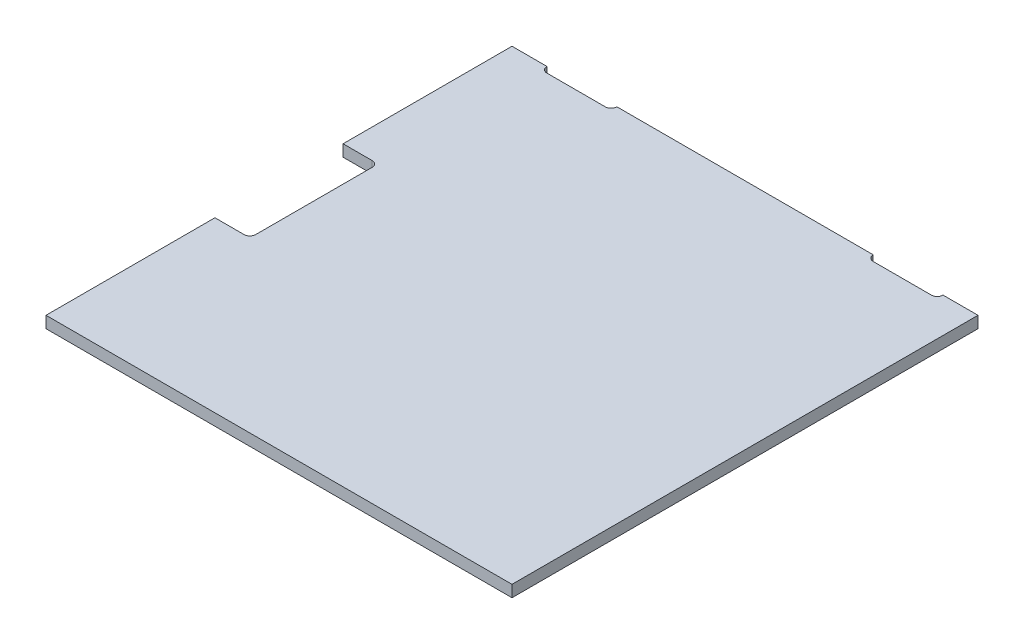
ISO-10303-21;
HEADER;
FILE_DESCRIPTION(('STEP AP214'),'2;1');
FILE_NAME('part.step','',(''),(''),'','','');
FILE_SCHEMA(('AUTOMOTIVE_DESIGN { 1 0 10303 214 1 1 1 1 }'));
ENDSEC;
DATA;
#1=APPLICATION_CONTEXT('core data for automotive mechanical design processes');
#2=APPLICATION_PROTOCOL_DEFINITION('international standard','automotive_design',2000,#1);
#3=PRODUCT_CONTEXT('',#1,'mechanical');
#4=PRODUCT('Part','Part','',(#3));
#5=PRODUCT_RELATED_PRODUCT_CATEGORY('part','',(#4));
#6=PRODUCT_DEFINITION_FORMATION('','',#4);
#7=PRODUCT_DEFINITION_CONTEXT('part definition',#1,'design');
#8=PRODUCT_DEFINITION('design','',#6,#7);
#9=PRODUCT_DEFINITION_SHAPE('','',#8);
#10=(LENGTH_UNIT() NAMED_UNIT(*) SI_UNIT(.MILLI.,.METRE.));
#11=(NAMED_UNIT(*) PLANE_ANGLE_UNIT() SI_UNIT($,.RADIAN.));
#12=(NAMED_UNIT(*) SI_UNIT($,.STERADIAN.) SOLID_ANGLE_UNIT());
#13=UNCERTAINTY_MEASURE_WITH_UNIT(LENGTH_MEASURE(1.E-05),#10,'distance_accuracy_value','');
#14=(GEOMETRIC_REPRESENTATION_CONTEXT(3) GLOBAL_UNCERTAINTY_ASSIGNED_CONTEXT((#13)) GLOBAL_UNIT_ASSIGNED_CONTEXT((#10,
#11,#12)) REPRESENTATION_CONTEXT('',''));
#15=CARTESIAN_POINT('',(0.,0.,0.));
#16=DIRECTION('',(0.,0.,1.));
#17=DIRECTION('',(1.,0.,0.));
#18=AXIS2_PLACEMENT_3D('',#15,#16,#17);
#19=CARTESIAN_POINT('',(-40.,2.,-40.));
#20=DIRECTION('',(0.,0.,1.));
#21=DIRECTION('',(1.,0.,0.));
#22=AXIS2_PLACEMENT_3D('',#19,#20,#21);
#23=PLANE('',#22);
#24=DIRECTION('',(-1.,0.,0.));
#25=VECTOR('',#24,1.);
#26=CARTESIAN_POINT('',(-40.,0.,-40.));
#27=LINE('',#26,#25);
#28=CARTESIAN_POINT('',(22.,0.,-40.));
#29=VERTEX_POINT('',#28);
#30=CARTESIAN_POINT('',(-22.,0.,-40.));
#31=VERTEX_POINT('',#30);
#32=EDGE_CURVE('E184',#29,#31,#27,.T.);
#33=ORIENTED_EDGE('',*,*,#32,.T.);
#34=DIRECTION('',(0.,1.,0.));
#35=VECTOR('',#34,1.);
#36=CARTESIAN_POINT('',(-22.,0.,-40.));
#37=LINE('',#36,#35);
#38=CARTESIAN_POINT('',(-22.,2.,-40.));
#39=VERTEX_POINT('',#38);
#40=EDGE_CURVE('E174',#31,#39,#37,.T.);
#41=ORIENTED_EDGE('',*,*,#40,.T.);
#42=DIRECTION('',(-1.,0.,0.));
#43=VECTOR('',#42,1.);
#44=CARTESIAN_POINT('',(-40.,2.,-40.));
#45=LINE('',#44,#43);
#46=CARTESIAN_POINT('',(22.,2.,-40.));
#47=VERTEX_POINT('',#46);
#48=EDGE_CURVE('E351',#47,#39,#45,.T.);
#49=ORIENTED_EDGE('',*,*,#48,.F.);
#50=DIRECTION('',(0.,1.,0.));
#51=VECTOR('',#50,1.);
#52=CARTESIAN_POINT('',(22.,0.,-40.));
#53=LINE('',#52,#51);
#54=EDGE_CURVE('E333',#29,#47,#53,.T.);
#55=ORIENTED_EDGE('',*,*,#54,.F.);
#56=EDGE_LOOP('',(#33,#41,#49,#55));
#57=FACE_BOUND('',#56,.T.);
#58=ADVANCED_FACE('F38',(#57),#23,.F.);
#59=CARTESIAN_POINT('',(-34.,2.,-40.));
#60=VERTEX_POINT('',#59);
#61=CARTESIAN_POINT('',(-40.,2.,-40.));
#62=VERTEX_POINT('',#61);
#63=EDGE_CURVE('E170',#60,#62,#45,.T.);
#64=ORIENTED_EDGE('',*,*,#63,.F.);
#65=DIRECTION('',(0.,1.,0.));
#66=VECTOR('',#65,1.);
#67=CARTESIAN_POINT('',(-34.,0.,-40.));
#68=LINE('',#67,#66);
#69=CARTESIAN_POINT('',(-34.,0.,-40.));
#70=VERTEX_POINT('',#69);
#71=EDGE_CURVE('E164',#70,#60,#68,.T.);
#72=ORIENTED_EDGE('',*,*,#71,.F.);
#73=CARTESIAN_POINT('',(-40.,0.,-40.));
#74=VERTEX_POINT('',#73);
#75=EDGE_CURVE('E168',#70,#74,#27,.T.);
#76=ORIENTED_EDGE('',*,*,#75,.T.);
#77=DIRECTION('',(0.,-1.,0.));
#78=VECTOR('',#77,1.);
#79=CARTESIAN_POINT('',(-40.,2.,-40.));
#80=LINE('',#79,#78);
#81=EDGE_CURVE('E286',#62,#74,#80,.T.);
#82=ORIENTED_EDGE('',*,*,#81,.F.);
#83=EDGE_LOOP('',(#64,#72,#76,#82));
#84=FACE_BOUND('',#83,.T.);
#85=ADVANCED_FACE('F166',(#84),#23,.F.);
#86=CARTESIAN_POINT('',(40.,2.,40.));
#87=DIRECTION('',(-1.,0.,0.));
#88=DIRECTION('',(0.,0.,1.));
#89=AXIS2_PLACEMENT_3D('',#86,#87,#88);
#90=PLANE('',#89);
#91=DIRECTION('',(0.,0.,-1.));
#92=VECTOR('',#91,1.);
#93=CARTESIAN_POINT('',(40.,0.,40.));
#94=LINE('',#93,#92);
#95=CARTESIAN_POINT('',(40.,0.,40.));
#96=VERTEX_POINT('',#95);
#97=CARTESIAN_POINT('',(40.,0.,-40.));
#98=VERTEX_POINT('',#97);
#99=EDGE_CURVE('E185',#96,#98,#94,.T.);
#100=ORIENTED_EDGE('',*,*,#99,.T.);
#101=DIRECTION('',(0.,-1.,0.));
#102=VECTOR('',#101,1.);
#103=CARTESIAN_POINT('',(40.,2.,-40.));
#104=LINE('',#103,#102);
#105=CARTESIAN_POINT('',(40.,2.,-40.));
#106=VERTEX_POINT('',#105);
#107=EDGE_CURVE('E289',#106,#98,#104,.T.);
#108=ORIENTED_EDGE('',*,*,#107,.F.);
#109=DIRECTION('',(0.,0.,-1.));
#110=VECTOR('',#109,1.);
#111=CARTESIAN_POINT('',(40.,2.,40.));
#112=LINE('',#111,#110);
#113=CARTESIAN_POINT('',(40.,2.,40.));
#114=VERTEX_POINT('',#113);
#115=EDGE_CURVE('E270',#114,#106,#112,.T.);
#116=ORIENTED_EDGE('',*,*,#115,.F.);
#117=DIRECTION('',(0.,-1.,0.));
#118=VECTOR('',#117,1.);
#119=CARTESIAN_POINT('',(40.,2.,40.));
#120=LINE('',#119,#118);
#121=EDGE_CURVE('E271',#114,#96,#120,.T.);
#122=ORIENTED_EDGE('',*,*,#121,.T.);
#123=EDGE_LOOP('',(#100,#108,#116,#122));
#124=FACE_BOUND('',#123,.T.);
#125=ADVANCED_FACE('F383',(#124),#90,.F.);
#126=CARTESIAN_POINT('',(34.,0.,-40.));
#127=VERTEX_POINT('',#126);
#128=EDGE_CURVE('E187',#98,#127,#27,.T.);
#129=ORIENTED_EDGE('',*,*,#128,.T.);
#130=DIRECTION('',(0.,1.,0.));
#131=VECTOR('',#130,1.);
#132=CARTESIAN_POINT('',(34.,0.,-40.));
#133=LINE('',#132,#131);
#134=CARTESIAN_POINT('',(34.,2.,-40.));
#135=VERTEX_POINT('',#134);
#136=EDGE_CURVE('E326',#127,#135,#133,.T.);
#137=ORIENTED_EDGE('',*,*,#136,.T.);
#138=EDGE_CURVE('E347',#106,#135,#45,.T.);
#139=ORIENTED_EDGE('',*,*,#138,.F.);
#140=ORIENTED_EDGE('',*,*,#107,.T.);
#141=EDGE_LOOP('',(#129,#137,#139,#140));
#142=FACE_BOUND('',#141,.T.);
#143=ADVANCED_FACE('F325',(#142),#23,.F.);
#144=CARTESIAN_POINT('',(-40.,2.,-11.));
#145=DIRECTION('',(1.,0.,0.));
#146=DIRECTION('',(0.,0.,-1.));
#147=AXIS2_PLACEMENT_3D('',#144,#145,#146);
#148=PLANE('',#147);
#149=DIRECTION('',(0.,0.,1.));
#150=VECTOR('',#149,1.);
#151=CARTESIAN_POINT('',(-40.,0.,-11.));
#152=LINE('',#151,#150);
#153=CARTESIAN_POINT('',(-40.,0.,-11.));
#154=VERTEX_POINT('',#153);
#155=EDGE_CURVE('E182',#74,#154,#152,.T.);
#156=ORIENTED_EDGE('',*,*,#155,.T.);
#157=DIRECTION('',(0.,-1.,0.));
#158=VECTOR('',#157,1.);
#159=CARTESIAN_POINT('',(-40.,2.,-11.));
#160=LINE('',#159,#158);
#161=CARTESIAN_POINT('',(-40.,2.,-11.));
#162=VERTEX_POINT('',#161);
#163=EDGE_CURVE('E282',#162,#154,#160,.T.);
#164=ORIENTED_EDGE('',*,*,#163,.F.);
#165=DIRECTION('',(0.,0.,1.));
#166=VECTOR('',#165,1.);
#167=CARTESIAN_POINT('',(-40.,2.,-11.));
#168=LINE('',#167,#166);
#169=EDGE_CURVE('E350',#62,#162,#168,.T.);
#170=ORIENTED_EDGE('',*,*,#169,.F.);
#171=ORIENTED_EDGE('',*,*,#81,.T.);
#172=EDGE_LOOP('',(#156,#164,#170,#171));
#173=FACE_BOUND('',#172,.T.);
#174=ADVANCED_FACE('F367',(#173),#148,.F.);
#175=CARTESIAN_POINT('',(-34.,2.,-11.));
#176=DIRECTION('',(0.,0.,-1.));
#177=DIRECTION('',(-1.,0.,0.));
#178=AXIS2_PLACEMENT_3D('',#175,#176,#177);
#179=PLANE('',#178);
#180=DIRECTION('',(1.,0.,0.));
#181=VECTOR('',#180,1.);
#182=CARTESIAN_POINT('',(-34.,0.,-11.));
#183=LINE('',#182,#181);
#184=CARTESIAN_POINT('',(-35.,0.,-11.));
#185=VERTEX_POINT('',#184);
#186=EDGE_CURVE('E256',#154,#185,#183,.T.);
#187=ORIENTED_EDGE('',*,*,#186,.T.);
#188=DIRECTION('',(0.,-1.,0.));
#189=VECTOR('',#188,1.);
#190=CARTESIAN_POINT('',(-35.,2.,-11.));
#191=LINE('',#190,#189);
#192=CARTESIAN_POINT('',(-35.,2.,-11.));
#193=VERTEX_POINT('',#192);
#194=EDGE_CURVE('E54',#185,#193,#191,.F.);
#195=ORIENTED_EDGE('',*,*,#194,.T.);
#196=DIRECTION('',(1.,0.,0.));
#197=VECTOR('',#196,1.);
#198=CARTESIAN_POINT('',(-34.,2.,-11.));
#199=LINE('',#198,#197);
#200=EDGE_CURVE('E354',#162,#193,#199,.T.);
#201=ORIENTED_EDGE('',*,*,#200,.F.);
#202=ORIENTED_EDGE('',*,*,#163,.T.);
#203=EDGE_LOOP('',(#187,#195,#201,#202));
#204=FACE_BOUND('',#203,.T.);
#205=ADVANCED_FACE('F369',(#204),#179,.F.);
#206=CARTESIAN_POINT('',(-34.,2.,-11.));
#207=DIRECTION('',(1.,0.,0.));
#208=DIRECTION('',(0.,0.,-1.));
#209=AXIS2_PLACEMENT_3D('',#206,#207,#208);
#210=PLANE('',#209);
#211=DIRECTION('',(0.,0.,1.));
#212=VECTOR('',#211,1.);
#213=CARTESIAN_POINT('',(-34.,0.,-11.));
#214=LINE('',#213,#212);
#215=CARTESIAN_POINT('',(-34.,0.,-10.));
#216=VERTEX_POINT('',#215);
#217=CARTESIAN_POINT('',(-34.,0.,10.));
#218=VERTEX_POINT('',#217);
#219=EDGE_CURVE('E249',#216,#218,#214,.T.);
#220=ORIENTED_EDGE('',*,*,#219,.T.);
#221=DIRECTION('',(0.,-1.,0.));
#222=VECTOR('',#221,1.);
#223=CARTESIAN_POINT('',(-34.,2.,10.));
#224=LINE('',#223,#222);
#225=CARTESIAN_POINT('',(-34.,2.,10.));
#226=VERTEX_POINT('',#225);
#227=EDGE_CURVE('E214',#218,#226,#224,.F.);
#228=ORIENTED_EDGE('',*,*,#227,.T.);
#229=DIRECTION('',(0.,0.,1.));
#230=VECTOR('',#229,1.);
#231=CARTESIAN_POINT('',(-34.,2.,-11.));
#232=LINE('',#231,#230);
#233=CARTESIAN_POINT('',(-34.,2.,-10.));
#234=VERTEX_POINT('',#233);
#235=EDGE_CURVE('E234',#234,#226,#232,.T.);
#236=ORIENTED_EDGE('',*,*,#235,.F.);
#237=DIRECTION('',(0.,-1.,0.));
#238=VECTOR('',#237,1.);
#239=CARTESIAN_POINT('',(-34.,0.,-10.));
#240=LINE('',#239,#238);
#241=EDGE_CURVE('E210',#234,#216,#240,.T.);
#242=ORIENTED_EDGE('',*,*,#241,.T.);
#243=EDGE_LOOP('',(#220,#228,#236,#242));
#244=FACE_BOUND('',#243,.T.);
#245=ADVANCED_FACE('F253',(#244),#210,.F.);
#246=CARTESIAN_POINT('',(-34.,2.,11.));
#247=DIRECTION('',(0.,0.,1.));
#248=DIRECTION('',(1.,0.,0.));
#249=AXIS2_PLACEMENT_3D('',#246,#247,#248);
#250=PLANE('',#249);
#251=DIRECTION('',(-1.,0.,0.));
#252=VECTOR('',#251,1.);
#253=CARTESIAN_POINT('',(-34.,2.,11.));
#254=LINE('',#253,#252);
#255=CARTESIAN_POINT('',(-35.,2.,11.));
#256=VERTEX_POINT('',#255);
#257=CARTESIAN_POINT('',(-40.,2.,11.));
#258=VERTEX_POINT('',#257);
#259=EDGE_CURVE('E231',#256,#258,#254,.T.);
#260=ORIENTED_EDGE('',*,*,#259,.F.);
#261=DIRECTION('',(0.,-1.,0.));
#262=VECTOR('',#261,1.);
#263=CARTESIAN_POINT('',(-35.,0.,11.));
#264=LINE('',#263,#262);
#265=CARTESIAN_POINT('',(-35.,0.,11.));
#266=VERTEX_POINT('',#265);
#267=EDGE_CURVE('E206',#256,#266,#264,.T.);
#268=ORIENTED_EDGE('',*,*,#267,.T.);
#269=DIRECTION('',(-1.,0.,0.));
#270=VECTOR('',#269,1.);
#271=CARTESIAN_POINT('',(-34.,0.,11.));
#272=LINE('',#271,#270);
#273=CARTESIAN_POINT('',(-40.,0.,11.));
#274=VERTEX_POINT('',#273);
#275=EDGE_CURVE('E251',#266,#274,#272,.T.);
#276=ORIENTED_EDGE('',*,*,#275,.T.);
#277=DIRECTION('',(0.,-1.,0.));
#278=VECTOR('',#277,1.);
#279=CARTESIAN_POINT('',(-40.,2.,11.));
#280=LINE('',#279,#278);
#281=EDGE_CURVE('E242',#258,#274,#280,.T.);
#282=ORIENTED_EDGE('',*,*,#281,.F.);
#283=EDGE_LOOP('',(#260,#268,#276,#282));
#284=FACE_BOUND('',#283,.T.);
#285=ADVANCED_FACE('F239',(#284),#250,.F.);
#286=CARTESIAN_POINT('',(-40.,2.,40.));
#287=DIRECTION('',(1.,0.,0.));
#288=DIRECTION('',(0.,0.,-1.));
#289=AXIS2_PLACEMENT_3D('',#286,#287,#288);
#290=PLANE('',#289);
#291=DIRECTION('',(0.,0.,1.));
#292=VECTOR('',#291,1.);
#293=CARTESIAN_POINT('',(-40.,0.,40.));
#294=LINE('',#293,#292);
#295=CARTESIAN_POINT('',(-40.,0.,40.));
#296=VERTEX_POINT('',#295);
#297=EDGE_CURVE('E260',#274,#296,#294,.T.);
#298=ORIENTED_EDGE('',*,*,#297,.T.);
#299=DIRECTION('',(0.,-1.,0.));
#300=VECTOR('',#299,1.);
#301=CARTESIAN_POINT('',(-40.,2.,40.));
#302=LINE('',#301,#300);
#303=CARTESIAN_POINT('',(-40.,2.,40.));
#304=VERTEX_POINT('',#303);
#305=EDGE_CURVE('E275',#304,#296,#302,.T.);
#306=ORIENTED_EDGE('',*,*,#305,.F.);
#307=DIRECTION('',(0.,0.,1.));
#308=VECTOR('',#307,1.);
#309=CARTESIAN_POINT('',(-40.,2.,40.));
#310=LINE('',#309,#308);
#311=EDGE_CURVE('E245',#258,#304,#310,.T.);
#312=ORIENTED_EDGE('',*,*,#311,.F.);
#313=ORIENTED_EDGE('',*,*,#281,.T.);
#314=EDGE_LOOP('',(#298,#306,#312,#313));
#315=FACE_BOUND('',#314,.T.);
#316=ADVANCED_FACE('F440',(#315),#290,.F.);
#317=CARTESIAN_POINT('',(-40.,2.,40.));
#318=DIRECTION('',(0.,0.,-1.));
#319=DIRECTION('',(-1.,0.,0.));
#320=AXIS2_PLACEMENT_3D('',#317,#318,#319);
#321=PLANE('',#320);
#322=DIRECTION('',(1.,0.,0.));
#323=VECTOR('',#322,1.);
#324=CARTESIAN_POINT('',(-40.,0.,40.));
#325=LINE('',#324,#323);
#326=EDGE_CURVE('E267',#296,#96,#325,.T.);
#327=ORIENTED_EDGE('',*,*,#326,.T.);
#328=ORIENTED_EDGE('',*,*,#121,.F.);
#329=DIRECTION('',(1.,0.,0.));
#330=VECTOR('',#329,1.);
#331=CARTESIAN_POINT('',(-40.,2.,40.));
#332=LINE('',#331,#330);
#333=EDGE_CURVE('E276',#304,#114,#332,.T.);
#334=ORIENTED_EDGE('',*,*,#333,.F.);
#335=ORIENTED_EDGE('',*,*,#305,.T.);
#336=EDGE_LOOP('',(#327,#328,#334,#335));
#337=FACE_BOUND('',#336,.T.);
#338=ADVANCED_FACE('F437',(#337),#321,.F.);
#339=CARTESIAN_POINT('',(0.,2.,0.));
#340=DIRECTION('',(0.,-1.,0.));
#341=DIRECTION('',(0.,0.,-1.));
#342=AXIS2_PLACEMENT_3D('',#339,#340,#341);
#343=PLANE('',#342);
#344=ORIENTED_EDGE('',*,*,#48,.T.);
#345=CARTESIAN_POINT('',(-23.,2.,-40.));
#346=DIRECTION('',(0.,-1.,0.));
#347=DIRECTION('',(0.,0.,-1.));
#348=AXIS2_PLACEMENT_3D('',#345,#346,#347);
#349=CIRCLE('',#348,1.);
#350=CARTESIAN_POINT('',(-23.,2.,-39.));
#351=VERTEX_POINT('',#350);
#352=EDGE_CURVE('E193',#39,#351,#349,.T.);
#353=ORIENTED_EDGE('',*,*,#352,.T.);
#354=DIRECTION('',(1.,0.,0.));
#355=VECTOR('',#354,1.);
#356=CARTESIAN_POINT('',(-34.,2.,-39.));
#357=LINE('',#356,#355);
#358=CARTESIAN_POINT('',(-33.,2.,-39.));
#359=VERTEX_POINT('',#358);
#360=EDGE_CURVE('E338',#359,#351,#357,.T.);
#361=ORIENTED_EDGE('',*,*,#360,.F.);
#362=CARTESIAN_POINT('',(-33.,2.,-40.));
#363=DIRECTION('',(0.,-1.,0.));
#364=DIRECTION('',(0.,0.,-1.));
#365=AXIS2_PLACEMENT_3D('',#362,#363,#364);
#366=CIRCLE('',#365,1.);
#367=EDGE_CURVE('E194',#359,#60,#366,.T.);
#368=ORIENTED_EDGE('',*,*,#367,.T.);
#369=ORIENTED_EDGE('',*,*,#63,.T.);
#370=ORIENTED_EDGE('',*,*,#169,.T.);
#371=ORIENTED_EDGE('',*,*,#200,.T.);
#372=CARTESIAN_POINT('',(-35.,2.,-10.));
#373=DIRECTION('',(0.,-1.,0.));
#374=DIRECTION('',(0.,0.,-1.));
#375=AXIS2_PLACEMENT_3D('',#372,#373,#374);
#376=CIRCLE('',#375,1.);
#377=EDGE_CURVE('E11',#193,#234,#376,.T.);
#378=ORIENTED_EDGE('',*,*,#377,.T.);
#379=ORIENTED_EDGE('',*,*,#235,.T.);
#380=CARTESIAN_POINT('',(-35.,2.,10.));
#381=DIRECTION('',(0.,-1.,0.));
#382=DIRECTION('',(0.,0.,-1.));
#383=AXIS2_PLACEMENT_3D('',#380,#381,#382);
#384=CIRCLE('',#383,1.);
#385=EDGE_CURVE('E222',#226,#256,#384,.T.);
#386=ORIENTED_EDGE('',*,*,#385,.T.);
#387=ORIENTED_EDGE('',*,*,#259,.T.);
#388=ORIENTED_EDGE('',*,*,#311,.T.);
#389=ORIENTED_EDGE('',*,*,#333,.T.);
#390=ORIENTED_EDGE('',*,*,#115,.T.);
#391=ORIENTED_EDGE('',*,*,#138,.T.);
#392=CARTESIAN_POINT('',(33.,2.,-40.));
#393=DIRECTION('',(0.,-1.,0.));
#394=DIRECTION('',(0.,0.,-1.));
#395=AXIS2_PLACEMENT_3D('',#392,#393,#394);
#396=CIRCLE('',#395,1.);
#397=CARTESIAN_POINT('',(33.,2.,-39.));
#398=VERTEX_POINT('',#397);
#399=EDGE_CURVE('E311',#135,#398,#396,.T.);
#400=ORIENTED_EDGE('',*,*,#399,.T.);
#401=DIRECTION('',(1.,0.,0.));
#402=VECTOR('',#401,1.);
#403=CARTESIAN_POINT('',(34.,2.,-39.));
#404=LINE('',#403,#402);
#405=CARTESIAN_POINT('',(23.,2.,-39.));
#406=VERTEX_POINT('',#405);
#407=EDGE_CURVE('E340',#406,#398,#404,.T.);
#408=ORIENTED_EDGE('',*,*,#407,.F.);
#409=CARTESIAN_POINT('',(23.,2.,-40.));
#410=DIRECTION('',(0.,-1.,0.));
#411=DIRECTION('',(0.,0.,-1.));
#412=AXIS2_PLACEMENT_3D('',#409,#410,#411);
#413=CIRCLE('',#412,1.);
#414=EDGE_CURVE('E305',#406,#47,#413,.T.);
#415=ORIENTED_EDGE('',*,*,#414,.T.);
#416=EDGE_LOOP('',(#344,#353,#361,#368,#369,#370,#371,#378,#379,#386,#387,#388,#389,#390,#391,
#400,#408,#415));
#417=FACE_BOUND('',#416,.T.);
#418=ADVANCED_FACE('F230',(#417),#343,.F.);
#419=CARTESIAN_POINT('',(0.,0.,0.));
#420=DIRECTION('',(0.,-1.,0.));
#421=DIRECTION('',(0.,0.,-1.));
#422=AXIS2_PLACEMENT_3D('',#419,#420,#421);
#423=PLANE('',#422);
#424=DIRECTION('',(1.,0.,0.));
#425=VECTOR('',#424,1.);
#426=CARTESIAN_POINT('',(-34.,0.,-39.));
#427=LINE('',#426,#425);
#428=CARTESIAN_POINT('',(-33.,0.,-39.));
#429=VERTEX_POINT('',#428);
#430=CARTESIAN_POINT('',(-23.,0.,-39.));
#431=VERTEX_POINT('',#430);
#432=EDGE_CURVE('E175',#429,#431,#427,.T.);
#433=ORIENTED_EDGE('',*,*,#432,.T.);
#434=CARTESIAN_POINT('',(-23.,0.,-40.));
#435=DIRECTION('',(0.,-1.,0.));
#436=DIRECTION('',(0.,0.,-1.));
#437=AXIS2_PLACEMENT_3D('',#434,#435,#436);
#438=CIRCLE('',#437,1.);
#439=EDGE_CURVE('E198',#431,#31,#438,.F.);
#440=ORIENTED_EDGE('',*,*,#439,.T.);
#441=ORIENTED_EDGE('',*,*,#32,.F.);
#442=CARTESIAN_POINT('',(23.,0.,-40.));
#443=DIRECTION('',(0.,-1.,0.));
#444=DIRECTION('',(0.,0.,-1.));
#445=AXIS2_PLACEMENT_3D('',#442,#443,#444);
#446=CIRCLE('',#445,1.);
#447=CARTESIAN_POINT('',(23.,0.,-39.));
#448=VERTEX_POINT('',#447);
#449=EDGE_CURVE('E308',#29,#448,#446,.F.);
#450=ORIENTED_EDGE('',*,*,#449,.T.);
#451=DIRECTION('',(1.,0.,0.));
#452=VECTOR('',#451,1.);
#453=CARTESIAN_POINT('',(34.,0.,-39.));
#454=LINE('',#453,#452);
#455=CARTESIAN_POINT('',(33.,0.,-39.));
#456=VERTEX_POINT('',#455);
#457=EDGE_CURVE('E319',#448,#456,#454,.T.);
#458=ORIENTED_EDGE('',*,*,#457,.T.);
#459=CARTESIAN_POINT('',(33.,0.,-40.));
#460=DIRECTION('',(0.,-1.,0.));
#461=DIRECTION('',(0.,0.,-1.));
#462=AXIS2_PLACEMENT_3D('',#459,#460,#461);
#463=CIRCLE('',#462,1.);
#464=EDGE_CURVE('E200',#456,#127,#463,.F.);
#465=ORIENTED_EDGE('',*,*,#464,.T.);
#466=ORIENTED_EDGE('',*,*,#128,.F.);
#467=ORIENTED_EDGE('',*,*,#99,.F.);
#468=ORIENTED_EDGE('',*,*,#326,.F.);
#469=ORIENTED_EDGE('',*,*,#297,.F.);
#470=ORIENTED_EDGE('',*,*,#275,.F.);
#471=CARTESIAN_POINT('',(-35.,0.,10.));
#472=DIRECTION('',(0.,-1.,0.));
#473=DIRECTION('',(0.,0.,-1.));
#474=AXIS2_PLACEMENT_3D('',#471,#472,#473);
#475=CIRCLE('',#474,1.);
#476=EDGE_CURVE('E219',#266,#218,#475,.F.);
#477=ORIENTED_EDGE('',*,*,#476,.T.);
#478=ORIENTED_EDGE('',*,*,#219,.F.);
#479=CARTESIAN_POINT('',(-35.,0.,-10.));
#480=DIRECTION('',(0.,-1.,0.));
#481=DIRECTION('',(0.,0.,-1.));
#482=AXIS2_PLACEMENT_3D('',#479,#480,#481);
#483=CIRCLE('',#482,1.);
#484=EDGE_CURVE('E47',#216,#185,#483,.F.);
#485=ORIENTED_EDGE('',*,*,#484,.T.);
#486=ORIENTED_EDGE('',*,*,#186,.F.);
#487=ORIENTED_EDGE('',*,*,#155,.F.);
#488=ORIENTED_EDGE('',*,*,#75,.F.);
#489=CARTESIAN_POINT('',(-33.,0.,-40.));
#490=DIRECTION('',(0.,-1.,0.));
#491=DIRECTION('',(0.,0.,-1.));
#492=AXIS2_PLACEMENT_3D('',#489,#490,#491);
#493=CIRCLE('',#492,1.);
#494=EDGE_CURVE('E180',#70,#429,#493,.F.);
#495=ORIENTED_EDGE('',*,*,#494,.T.);
#496=EDGE_LOOP('',(#433,#440,#441,#450,#458,#465,#466,#467,#468,#469,#470,#477,#478,#485,#486,
#487,#488,#495));
#497=FACE_BOUND('',#496,.T.);
#498=ADVANCED_FACE('F179',(#497),#423,.T.);
#499=CARTESIAN_POINT('',(34.,0.,-39.));
#500=DIRECTION('',(0.,0.,1.));
#501=DIRECTION('',(1.,0.,0.));
#502=AXIS2_PLACEMENT_3D('',#499,#500,#501);
#503=PLANE('',#502);
#504=ORIENTED_EDGE('',*,*,#457,.F.);
#505=DIRECTION('',(0.,1.,0.));
#506=VECTOR('',#505,1.);
#507=CARTESIAN_POINT('',(23.,2.,-39.));
#508=LINE('',#507,#506);
#509=EDGE_CURVE('E296',#448,#406,#508,.T.);
#510=ORIENTED_EDGE('',*,*,#509,.T.);
#511=ORIENTED_EDGE('',*,*,#407,.T.);
#512=DIRECTION('',(0.,1.,0.));
#513=VECTOR('',#512,1.);
#514=CARTESIAN_POINT('',(33.,0.,-39.));
#515=LINE('',#514,#513);
#516=EDGE_CURVE('E293',#398,#456,#515,.F.);
#517=ORIENTED_EDGE('',*,*,#516,.T.);
#518=EDGE_LOOP('',(#504,#510,#511,#517));
#519=FACE_BOUND('',#518,.T.);
#520=ADVANCED_FACE('F430',(#519),#503,.F.);
#521=CARTESIAN_POINT('',(-34.,0.,-39.));
#522=DIRECTION('',(0.,0.,1.));
#523=DIRECTION('',(1.,0.,0.));
#524=AXIS2_PLACEMENT_3D('',#521,#522,#523);
#525=PLANE('',#524);
#526=ORIENTED_EDGE('',*,*,#432,.F.);
#527=DIRECTION('',(0.,1.,0.));
#528=VECTOR('',#527,1.);
#529=CARTESIAN_POINT('',(-33.,2.,-39.));
#530=LINE('',#529,#528);
#531=EDGE_CURVE('E191',#429,#359,#530,.T.);
#532=ORIENTED_EDGE('',*,*,#531,.T.);
#533=ORIENTED_EDGE('',*,*,#360,.T.);
#534=DIRECTION('',(0.,1.,0.));
#535=VECTOR('',#534,1.);
#536=CARTESIAN_POINT('',(-23.,0.,-39.));
#537=LINE('',#536,#535);
#538=EDGE_CURVE('E300',#351,#431,#537,.F.);
#539=ORIENTED_EDGE('',*,*,#538,.T.);
#540=EDGE_LOOP('',(#526,#532,#533,#539));
#541=FACE_BOUND('',#540,.T.);
#542=ADVANCED_FACE('F399',(#541),#525,.F.);
#543=CARTESIAN_POINT('',(23.,0.,-40.));
#544=DIRECTION('',(0.,-1.,0.));
#545=DIRECTION('',(0.,0.,-1.));
#546=AXIS2_PLACEMENT_3D('',#543,#544,#545);
#547=CYLINDRICAL_SURFACE('',#546,1.);
#548=ORIENTED_EDGE('',*,*,#449,.F.);
#549=ORIENTED_EDGE('',*,*,#54,.T.);
#550=ORIENTED_EDGE('',*,*,#414,.F.);
#551=ORIENTED_EDGE('',*,*,#509,.F.);
#552=EDGE_LOOP('',(#548,#549,#550,#551));
#553=FACE_BOUND('',#552,.T.);
#554=ADVANCED_FACE('F396',(#553),#547,.F.);
#555=CARTESIAN_POINT('',(33.,0.,-40.));
#556=DIRECTION('',(0.,-1.,0.));
#557=DIRECTION('',(0.,0.,-1.));
#558=AXIS2_PLACEMENT_3D('',#555,#556,#557);
#559=CYLINDRICAL_SURFACE('',#558,1.);
#560=ORIENTED_EDGE('',*,*,#464,.F.);
#561=ORIENTED_EDGE('',*,*,#516,.F.);
#562=ORIENTED_EDGE('',*,*,#399,.F.);
#563=ORIENTED_EDGE('',*,*,#136,.F.);
#564=EDGE_LOOP('',(#560,#561,#562,#563));
#565=FACE_BOUND('',#564,.T.);
#566=ADVANCED_FACE('F331',(#565),#559,.F.);
#567=CARTESIAN_POINT('',(-33.,0.,-40.));
#568=DIRECTION('',(0.,-1.,0.));
#569=DIRECTION('',(0.,0.,-1.));
#570=AXIS2_PLACEMENT_3D('',#567,#568,#569);
#571=CYLINDRICAL_SURFACE('',#570,1.);
#572=ORIENTED_EDGE('',*,*,#494,.F.);
#573=ORIENTED_EDGE('',*,*,#71,.T.);
#574=ORIENTED_EDGE('',*,*,#367,.F.);
#575=ORIENTED_EDGE('',*,*,#531,.F.);
#576=EDGE_LOOP('',(#572,#573,#574,#575));
#577=FACE_BOUND('',#576,.T.);
#578=ADVANCED_FACE('F189',(#577),#571,.F.);
#579=CARTESIAN_POINT('',(-23.,0.,-40.));
#580=DIRECTION('',(0.,-1.,0.));
#581=DIRECTION('',(0.,0.,-1.));
#582=AXIS2_PLACEMENT_3D('',#579,#580,#581);
#583=CYLINDRICAL_SURFACE('',#582,1.);
#584=ORIENTED_EDGE('',*,*,#439,.F.);
#585=ORIENTED_EDGE('',*,*,#538,.F.);
#586=ORIENTED_EDGE('',*,*,#352,.F.);
#587=ORIENTED_EDGE('',*,*,#40,.F.);
#588=EDGE_LOOP('',(#584,#585,#586,#587));
#589=FACE_BOUND('',#588,.T.);
#590=ADVANCED_FACE('F376',(#589),#583,.F.);
#591=CARTESIAN_POINT('',(-35.,2.,10.));
#592=DIRECTION('',(0.,1.,0.));
#593=DIRECTION('',(0.,0.,1.));
#594=AXIS2_PLACEMENT_3D('',#591,#592,#593);
#595=CYLINDRICAL_SURFACE('',#594,1.);
#596=ORIENTED_EDGE('',*,*,#385,.F.);
#597=ORIENTED_EDGE('',*,*,#227,.F.);
#598=ORIENTED_EDGE('',*,*,#476,.F.);
#599=ORIENTED_EDGE('',*,*,#267,.F.);
#600=EDGE_LOOP('',(#596,#597,#598,#599));
#601=FACE_BOUND('',#600,.T.);
#602=ADVANCED_FACE('F247',(#601),#595,.F.);
#603=CARTESIAN_POINT('',(-35.,2.,-10.));
#604=DIRECTION('',(0.,1.,0.));
#605=DIRECTION('',(0.,0.,1.));
#606=AXIS2_PLACEMENT_3D('',#603,#604,#605);
#607=CYLINDRICAL_SURFACE('',#606,1.);
#608=ORIENTED_EDGE('',*,*,#377,.F.);
#609=ORIENTED_EDGE('',*,*,#194,.F.);
#610=ORIENTED_EDGE('',*,*,#484,.F.);
#611=ORIENTED_EDGE('',*,*,#241,.F.);
#612=EDGE_LOOP('',(#608,#609,#610,#611));
#613=FACE_BOUND('',#612,.T.);
#614=ADVANCED_FACE('F40',(#613),#607,.F.);
#615=CLOSED_SHELL('',(#58,#85,#125,#143,#174,#205,#245,#285,#316,#338,#418,#498,#520,#542,#554,
#566,#578,#590,#602,#614));
#616=MANIFOLD_SOLID_BREP('B2',#615);
#617=ADVANCED_BREP_SHAPE_REPRESENTATION('',(#18,#616),#14);
#618=SHAPE_DEFINITION_REPRESENTATION(#9,#617);
ENDSEC;
END-ISO-10303-21;
